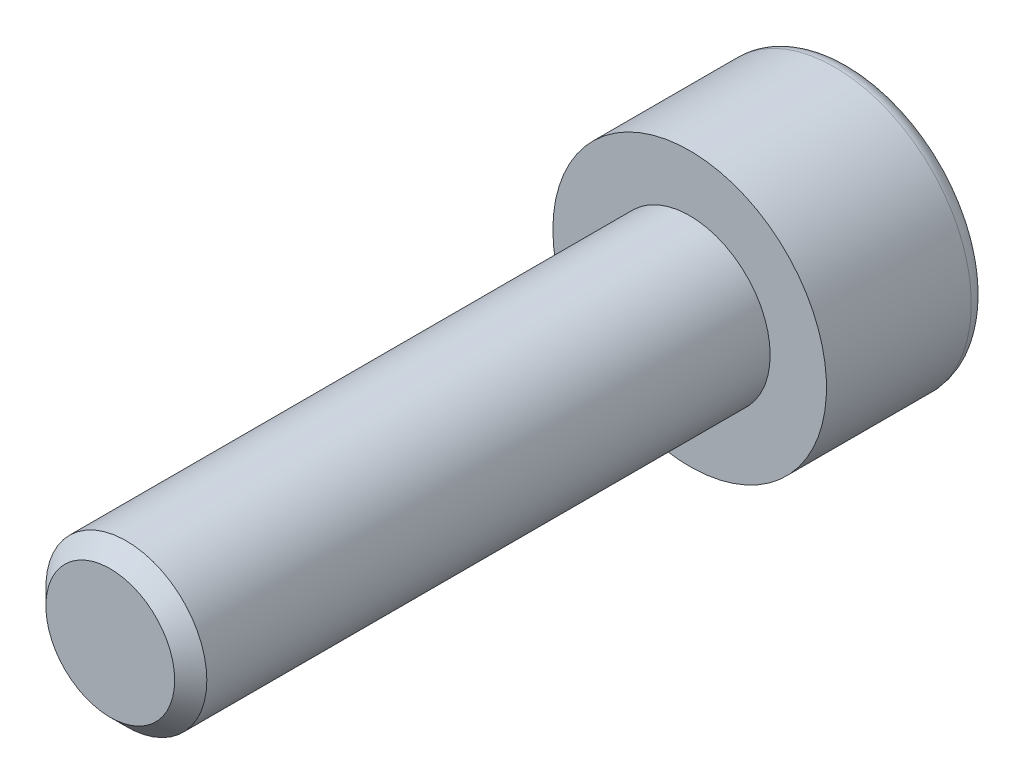
ISO-10303-21;
HEADER;
FILE_DESCRIPTION(('STEP AP214'),'2;1');
FILE_NAME('part.step','',(''),(''),'','','');
FILE_SCHEMA(('AUTOMOTIVE_DESIGN { 1 0 10303 214 1 1 1 1 }'));
ENDSEC;
DATA;
#1=APPLICATION_CONTEXT('core data for automotive mechanical design processes');
#2=APPLICATION_PROTOCOL_DEFINITION('international standard','automotive_design',2000,#1);
#3=PRODUCT_CONTEXT('',#1,'mechanical');
#4=PRODUCT('Part','Part','',(#3));
#5=PRODUCT_RELATED_PRODUCT_CATEGORY('part','',(#4));
#6=PRODUCT_DEFINITION_FORMATION('','',#4);
#7=PRODUCT_DEFINITION_CONTEXT('part definition',#1,'design');
#8=PRODUCT_DEFINITION('design','',#6,#7);
#9=PRODUCT_DEFINITION_SHAPE('','',#8);
#10=(LENGTH_UNIT() NAMED_UNIT(*) SI_UNIT(.MILLI.,.METRE.));
#11=(NAMED_UNIT(*) PLANE_ANGLE_UNIT() SI_UNIT($,.RADIAN.));
#12=(NAMED_UNIT(*) SI_UNIT($,.STERADIAN.) SOLID_ANGLE_UNIT());
#13=UNCERTAINTY_MEASURE_WITH_UNIT(LENGTH_MEASURE(1.E-05),#10,'distance_accuracy_value','');
#14=(GEOMETRIC_REPRESENTATION_CONTEXT(3) GLOBAL_UNCERTAINTY_ASSIGNED_CONTEXT((#13)) GLOBAL_UNIT_ASSIGNED_CONTEXT((#10,
#11,#12)) REPRESENTATION_CONTEXT('',''));
#15=CARTESIAN_POINT('',(0.,0.,0.));
#16=DIRECTION('',(0.,0.,1.));
#17=DIRECTION('',(1.,0.,0.));
#18=AXIS2_PLACEMENT_3D('',#15,#16,#17);
#19=CARTESIAN_POINT('',(0.,0.,-5.));
#20=DIRECTION('',(0.,0.,1.));
#21=DIRECTION('',(1.,0.,0.));
#22=AXIS2_PLACEMENT_3D('',#19,#20,#21);
#23=PLANE('',#22);
#24=CARTESIAN_POINT('',(0.,0.,-5.));
#25=DIRECTION('',(0.,0.,-1.));
#26=DIRECTION('',(-1.,0.,0.));
#27=AXIS2_PLACEMENT_3D('',#24,#25,#26);
#28=CIRCLE('',#27,3.75);
#29=CARTESIAN_POINT('',(-3.75,0.,-5.));
#30=VERTEX_POINT('',#29);
#31=EDGE_CURVE('E158',#30,#30,#28,.T.);
#32=ORIENTED_EDGE('',*,*,#31,.T.);
#33=EDGE_LOOP('',(#32));
#34=FACE_BOUND('',#33,.T.);
#35=DIRECTION('',(-0.86602540378444,0.499999999999997,0.));
#36=VECTOR('',#35,1.);
#37=CARTESIAN_POINT('',(0.,2.30940107675851,-5.));
#38=LINE('',#37,#36);
#39=CARTESIAN_POINT('',(2.,1.15470053837926,-5.));
#40=VERTEX_POINT('',#39);
#41=CARTESIAN_POINT('',(0.,2.30940107675851,-5.));
#42=VERTEX_POINT('',#41);
#43=EDGE_CURVE('E60',#40,#42,#38,.T.);
#44=ORIENTED_EDGE('',*,*,#43,.T.);
#45=DIRECTION('',(-0.866025403784438,-0.500000000000001,0.));
#46=VECTOR('',#45,1.);
#47=CARTESIAN_POINT('',(0.,2.30940107675851,-5.));
#48=LINE('',#47,#46);
#49=CARTESIAN_POINT('',(-2.,1.15470053837926,-5.));
#50=VERTEX_POINT('',#49);
#51=EDGE_CURVE('E131',#42,#50,#48,.T.);
#52=ORIENTED_EDGE('',*,*,#51,.T.);
#53=DIRECTION('',(0.,-1.,0.));
#54=VECTOR('',#53,1.);
#55=CARTESIAN_POINT('',(-2.,-1.15470053837926,-4.99999999999999));
#56=LINE('',#55,#54);
#57=CARTESIAN_POINT('',(-2.,-1.15470053837926,-4.99999999999999));
#58=VERTEX_POINT('',#57);
#59=EDGE_CURVE('E135',#50,#58,#56,.T.);
#60=ORIENTED_EDGE('',*,*,#59,.T.);
#61=DIRECTION('',(0.866025403784438,-0.500000000000001,0.));
#62=VECTOR('',#61,1.);
#63=CARTESIAN_POINT('',(0.,-2.3094010767585,-4.99999999999999));
#64=LINE('',#63,#62);
#65=CARTESIAN_POINT('',(0.,-2.3094010767585,-4.99999999999999));
#66=VERTEX_POINT('',#65);
#67=EDGE_CURVE('E138',#58,#66,#64,.T.);
#68=ORIENTED_EDGE('',*,*,#67,.T.);
#69=DIRECTION('',(0.86602540378444,0.499999999999998,0.));
#70=VECTOR('',#69,1.);
#71=CARTESIAN_POINT('',(0.,-2.3094010767585,-4.99999999999999));
#72=LINE('',#71,#70);
#73=CARTESIAN_POINT('',(2.,-1.15470053837925,-4.99999999999999));
#74=VERTEX_POINT('',#73);
#75=EDGE_CURVE('E121',#66,#74,#72,.T.);
#76=ORIENTED_EDGE('',*,*,#75,.T.);
#77=DIRECTION('',(0.,1.,0.));
#78=VECTOR('',#77,1.);
#79=CARTESIAN_POINT('',(2.,-1.15470053837925,-4.99999999999999));
#80=LINE('',#79,#78);
#81=EDGE_CURVE('E141',#74,#40,#80,.T.);
#82=ORIENTED_EDGE('',*,*,#81,.T.);
#83=EDGE_LOOP('',(#44,#52,#60,#68,#76,#82));
#84=FACE_BOUND('',#83,.T.);
#85=ADVANCED_FACE('F45',(#34,#84),#23,.F.);
#86=CARTESIAN_POINT('',(0.,0.,-4.5));
#87=DIRECTION('',(0.,0.,-1.));
#88=DIRECTION('',(-1.,0.,0.));
#89=AXIS2_PLACEMENT_3D('',#86,#87,#88);
#90=TOROIDAL_SURFACE('',#89,3.75,0.5);
#91=ORIENTED_EDGE('',*,*,#31,.F.);
#92=EDGE_LOOP('',(#91));
#93=FACE_BOUND('',#92,.T.);
#94=CARTESIAN_POINT('',(0.,0.,-4.5));
#95=DIRECTION('',(0.,0.,-1.));
#96=DIRECTION('',(-1.,0.,0.));
#97=AXIS2_PLACEMENT_3D('',#94,#95,#96);
#98=CIRCLE('',#97,4.25);
#99=CARTESIAN_POINT('',(-4.25,0.,-4.5));
#100=VERTEX_POINT('',#99);
#101=EDGE_CURVE('E155',#100,#100,#98,.T.);
#102=ORIENTED_EDGE('',*,*,#101,.T.);
#103=EDGE_LOOP('',(#102));
#104=FACE_BOUND('',#103,.T.);
#105=ADVANCED_FACE('F175',(#93,#104),#90,.T.);
#106=CARTESIAN_POINT('',(0.,0.,0.));
#107=DIRECTION('',(0.,0.,-1.));
#108=DIRECTION('',(-1.,0.,0.));
#109=AXIS2_PLACEMENT_3D('',#106,#107,#108);
#110=CYLINDRICAL_SURFACE('',#109,4.25);
#111=ORIENTED_EDGE('',*,*,#101,.F.);
#112=EDGE_LOOP('',(#111));
#113=FACE_BOUND('',#112,.T.);
#114=CARTESIAN_POINT('',(0.,0.,0.));
#115=DIRECTION('',(0.,0.,-1.));
#116=DIRECTION('',(-1.,0.,0.));
#117=AXIS2_PLACEMENT_3D('',#114,#115,#116);
#118=CIRCLE('',#117,4.25);
#119=CARTESIAN_POINT('',(-4.25,0.,0.));
#120=VERTEX_POINT('',#119);
#121=EDGE_CURVE('E152',#120,#120,#118,.T.);
#122=ORIENTED_EDGE('',*,*,#121,.T.);
#123=EDGE_LOOP('',(#122));
#124=FACE_BOUND('',#123,.T.);
#125=ADVANCED_FACE('F180',(#113,#124),#110,.T.);
#126=CARTESIAN_POINT('',(0.,0.,0.));
#127=DIRECTION('',(0.,0.,-1.));
#128=DIRECTION('',(-1.,0.,0.));
#129=AXIS2_PLACEMENT_3D('',#126,#127,#128);
#130=PLANE('',#129);
#131=CARTESIAN_POINT('',(0.,0.,0.));
#132=DIRECTION('',(0.,0.,1.));
#133=DIRECTION('',(1.,0.,0.));
#134=AXIS2_PLACEMENT_3D('',#131,#132,#133);
#135=CIRCLE('',#134,2.5);
#136=CARTESIAN_POINT('',(2.5,0.,0.));
#137=VERTEX_POINT('',#136);
#138=EDGE_CURVE('E132',#137,#137,#135,.T.);
#139=ORIENTED_EDGE('',*,*,#138,.F.);
#140=EDGE_LOOP('',(#139));
#141=FACE_BOUND('',#140,.T.);
#142=ORIENTED_EDGE('',*,*,#121,.F.);
#143=EDGE_LOOP('',(#142));
#144=FACE_BOUND('',#143,.T.);
#145=ADVANCED_FACE('F187',(#141,#144),#130,.F.);
#146=CARTESIAN_POINT('',(0.,2.30940107675851,-2.5));
#147=DIRECTION('',(-0.499999999999997,-0.86602540378444,0.));
#148=DIRECTION('',(0.86602540378444,-0.499999999999997,0.));
#149=AXIS2_PLACEMENT_3D('',#146,#147,#148);
#150=PLANE('',#149);
#151=ORIENTED_EDGE('',*,*,#43,.F.);
#152=DIRECTION('',(0.,0.,-1.));
#153=VECTOR('',#152,1.);
#154=CARTESIAN_POINT('',(2.,1.15470053837926,-2.5));
#155=LINE('',#154,#153);
#156=CARTESIAN_POINT('',(2.,1.15470053837926,-2.5));
#157=VERTEX_POINT('',#156);
#158=EDGE_CURVE('E126',#157,#40,#155,.T.);
#159=ORIENTED_EDGE('',*,*,#158,.F.);
#160=DIRECTION('',(-0.86602540378444,0.499999999999997,0.));
#161=VECTOR('',#160,1.);
#162=CARTESIAN_POINT('',(0.,2.30940107675851,-2.5));
#163=LINE('',#162,#161);
#164=CARTESIAN_POINT('',(0.,2.30940107675851,-2.5));
#165=VERTEX_POINT('',#164);
#166=EDGE_CURVE('E144',#157,#165,#163,.T.);
#167=ORIENTED_EDGE('',*,*,#166,.T.);
#168=DIRECTION('',(0.,0.,-1.));
#169=VECTOR('',#168,1.);
#170=CARTESIAN_POINT('',(0.,2.30940107675851,-2.5));
#171=LINE('',#170,#169);
#172=EDGE_CURVE('E150',#165,#42,#171,.T.);
#173=ORIENTED_EDGE('',*,*,#172,.T.);
#174=EDGE_LOOP('',(#151,#159,#167,#173));
#175=FACE_BOUND('',#174,.T.);
#176=ADVANCED_FACE('F191',(#175),#150,.T.);
#177=CARTESIAN_POINT('',(0.,2.30940107675851,-2.5));
#178=DIRECTION('',(0.500000000000001,-0.866025403784438,0.));
#179=DIRECTION('',(0.866025403784438,0.500000000000001,0.));
#180=AXIS2_PLACEMENT_3D('',#177,#178,#179);
#181=PLANE('',#180);
#182=ORIENTED_EDGE('',*,*,#51,.F.);
#183=ORIENTED_EDGE('',*,*,#172,.F.);
#184=DIRECTION('',(-0.866025403784438,-0.500000000000001,0.));
#185=VECTOR('',#184,1.);
#186=CARTESIAN_POINT('',(0.,2.30940107675851,-2.5));
#187=LINE('',#186,#185);
#188=CARTESIAN_POINT('',(-2.,1.15470053837926,-2.5));
#189=VERTEX_POINT('',#188);
#190=EDGE_CURVE('E99',#165,#189,#187,.T.);
#191=ORIENTED_EDGE('',*,*,#190,.T.);
#192=DIRECTION('',(0.,0.,-1.));
#193=VECTOR('',#192,1.);
#194=CARTESIAN_POINT('',(-2.,1.15470053837926,-2.5));
#195=LINE('',#194,#193);
#196=EDGE_CURVE('E148',#189,#50,#195,.T.);
#197=ORIENTED_EDGE('',*,*,#196,.T.);
#198=EDGE_LOOP('',(#182,#183,#191,#197));
#199=FACE_BOUND('',#198,.T.);
#200=ADVANCED_FACE('F195',(#199),#181,.T.);
#201=CARTESIAN_POINT('',(-2.,-1.15470053837926,-2.5));
#202=DIRECTION('',(1.,0.,0.));
#203=DIRECTION('',(0.,0.,-1.));
#204=AXIS2_PLACEMENT_3D('',#201,#202,#203);
#205=PLANE('',#204);
#206=ORIENTED_EDGE('',*,*,#59,.F.);
#207=ORIENTED_EDGE('',*,*,#196,.F.);
#208=DIRECTION('',(0.,-1.,0.));
#209=VECTOR('',#208,1.);
#210=CARTESIAN_POINT('',(-2.,-1.15470053837926,-2.5));
#211=LINE('',#210,#209);
#212=CARTESIAN_POINT('',(-2.,-1.15470053837926,-2.5));
#213=VERTEX_POINT('',#212);
#214=EDGE_CURVE('E117',#189,#213,#211,.T.);
#215=ORIENTED_EDGE('',*,*,#214,.T.);
#216=DIRECTION('',(0.,0.,-1.));
#217=VECTOR('',#216,1.);
#218=CARTESIAN_POINT('',(-2.,-1.15470053837926,-2.5));
#219=LINE('',#218,#217);
#220=EDGE_CURVE('E114',#213,#58,#219,.T.);
#221=ORIENTED_EDGE('',*,*,#220,.T.);
#222=EDGE_LOOP('',(#206,#207,#215,#221));
#223=FACE_BOUND('',#222,.T.);
#224=ADVANCED_FACE('F198',(#223),#205,.T.);
#225=CARTESIAN_POINT('',(0.,-2.3094010767585,-2.49999999999999));
#226=DIRECTION('',(0.500000000000001,0.866025403784438,0.));
#227=DIRECTION('',(-0.866025403784438,0.500000000000001,0.));
#228=AXIS2_PLACEMENT_3D('',#225,#226,#227);
#229=PLANE('',#228);
#230=ORIENTED_EDGE('',*,*,#67,.F.);
#231=ORIENTED_EDGE('',*,*,#220,.F.);
#232=DIRECTION('',(0.866025403784438,-0.500000000000001,0.));
#233=VECTOR('',#232,1.);
#234=CARTESIAN_POINT('',(0.,-2.3094010767585,-2.49999999999999));
#235=LINE('',#234,#233);
#236=CARTESIAN_POINT('',(0.,-2.3094010767585,-2.49999999999999));
#237=VERTEX_POINT('',#236);
#238=EDGE_CURVE('E109',#213,#237,#235,.T.);
#239=ORIENTED_EDGE('',*,*,#238,.T.);
#240=DIRECTION('',(0.,0.,-1.));
#241=VECTOR('',#240,1.);
#242=CARTESIAN_POINT('',(0.,-2.3094010767585,-2.49999999999999));
#243=LINE('',#242,#241);
#244=EDGE_CURVE('E113',#237,#66,#243,.T.);
#245=ORIENTED_EDGE('',*,*,#244,.T.);
#246=EDGE_LOOP('',(#230,#231,#239,#245));
#247=FACE_BOUND('',#246,.T.);
#248=ADVANCED_FACE('F112',(#247),#229,.T.);
#249=CARTESIAN_POINT('',(0.,-2.3094010767585,-2.49999999999999));
#250=DIRECTION('',(-0.499999999999998,0.86602540378444,0.));
#251=DIRECTION('',(-0.86602540378444,-0.499999999999998,0.));
#252=AXIS2_PLACEMENT_3D('',#249,#250,#251);
#253=PLANE('',#252);
#254=ORIENTED_EDGE('',*,*,#75,.F.);
#255=ORIENTED_EDGE('',*,*,#244,.F.);
#256=DIRECTION('',(0.86602540378444,0.499999999999998,0.));
#257=VECTOR('',#256,1.);
#258=CARTESIAN_POINT('',(0.,-2.3094010767585,-2.49999999999999));
#259=LINE('',#258,#257);
#260=CARTESIAN_POINT('',(2.,-1.15470053837925,-2.5));
#261=VERTEX_POINT('',#260);
#262=EDGE_CURVE('E116',#237,#261,#259,.T.);
#263=ORIENTED_EDGE('',*,*,#262,.T.);
#264=DIRECTION('',(0.,0.,-1.));
#265=VECTOR('',#264,1.);
#266=CARTESIAN_POINT('',(2.,-1.15470053837925,-2.5));
#267=LINE('',#266,#265);
#268=EDGE_CURVE('E90',#261,#74,#267,.T.);
#269=ORIENTED_EDGE('',*,*,#268,.T.);
#270=EDGE_LOOP('',(#254,#255,#263,#269));
#271=FACE_BOUND('',#270,.T.);
#272=ADVANCED_FACE('F119',(#271),#253,.T.);
#273=CARTESIAN_POINT('',(2.,-1.15470053837925,-2.5));
#274=DIRECTION('',(-1.,0.,0.));
#275=DIRECTION('',(0.,0.,1.));
#276=AXIS2_PLACEMENT_3D('',#273,#274,#275);
#277=PLANE('',#276);
#278=ORIENTED_EDGE('',*,*,#81,.F.);
#279=ORIENTED_EDGE('',*,*,#268,.F.);
#280=DIRECTION('',(0.,1.,0.));
#281=VECTOR('',#280,1.);
#282=CARTESIAN_POINT('',(2.,-1.15470053837925,-2.5));
#283=LINE('',#282,#281);
#284=EDGE_CURVE('E68',#261,#157,#283,.T.);
#285=ORIENTED_EDGE('',*,*,#284,.T.);
#286=ORIENTED_EDGE('',*,*,#158,.T.);
#287=EDGE_LOOP('',(#278,#279,#285,#286));
#288=FACE_BOUND('',#287,.T.);
#289=ADVANCED_FACE('F207',(#288),#277,.T.);
#290=CARTESIAN_POINT('',(2.,1.15470053837926,-2.5));
#291=DIRECTION('',(0.,0.,1.));
#292=DIRECTION('',(1.,0.,0.));
#293=AXIS2_PLACEMENT_3D('',#290,#291,#292);
#294=PLANE('',#293);
#295=ORIENTED_EDGE('',*,*,#166,.F.);
#296=ORIENTED_EDGE('',*,*,#284,.F.);
#297=ORIENTED_EDGE('',*,*,#262,.F.);
#298=ORIENTED_EDGE('',*,*,#238,.F.);
#299=ORIENTED_EDGE('',*,*,#214,.F.);
#300=ORIENTED_EDGE('',*,*,#190,.F.);
#301=EDGE_LOOP('',(#295,#296,#297,#298,#299,#300));
#302=FACE_BOUND('',#301,.T.);
#303=ADVANCED_FACE('F124',(#302),#294,.F.);
#304=CARTESIAN_POINT('',(0.,0.,18.));
#305=DIRECTION('',(0.,0.,1.));
#306=DIRECTION('',(1.,0.,0.));
#307=AXIS2_PLACEMENT_3D('',#304,#305,#306);
#308=PLANE('',#307);
#309=CARTESIAN_POINT('',(0.,0.,18.));
#310=DIRECTION('',(0.,0.,1.));
#311=DIRECTION('',(1.,0.,0.));
#312=AXIS2_PLACEMENT_3D('',#309,#310,#311);
#313=CIRCLE('',#312,2.);
#314=CARTESIAN_POINT('',(2.,0.,18.));
#315=VERTEX_POINT('',#314);
#316=EDGE_CURVE('E53',#315,#315,#313,.T.);
#317=ORIENTED_EDGE('',*,*,#316,.T.);
#318=EDGE_LOOP('',(#317));
#319=FACE_BOUND('',#318,.T.);
#320=ADVANCED_FACE('F163',(#319),#308,.T.);
#321=CARTESIAN_POINT('',(0.,0.,0.));
#322=DIRECTION('',(0.,0.,1.));
#323=DIRECTION('',(1.,0.,0.));
#324=AXIS2_PLACEMENT_3D('',#321,#322,#323);
#325=CYLINDRICAL_SURFACE('',#324,2.5);
#326=CARTESIAN_POINT('',(0.,0.,17.5));
#327=DIRECTION('',(0.,0.,1.));
#328=DIRECTION('',(1.,0.,0.));
#329=AXIS2_PLACEMENT_3D('',#326,#327,#328);
#330=CIRCLE('',#329,2.5);
#331=CARTESIAN_POINT('',(2.5,0.,17.5));
#332=VERTEX_POINT('',#331);
#333=EDGE_CURVE('E13',#332,#332,#330,.F.);
#334=ORIENTED_EDGE('',*,*,#333,.T.);
#335=EDGE_LOOP('',(#334));
#336=FACE_BOUND('',#335,.T.);
#337=ORIENTED_EDGE('',*,*,#138,.T.);
#338=EDGE_LOOP('',(#337));
#339=FACE_BOUND('',#338,.T.);
#340=ADVANCED_FACE('F166',(#336,#339),#325,.T.);
#341=CARTESIAN_POINT('',(0.,0.,18.));
#342=DIRECTION('',(0.,0.,-1.));
#343=DIRECTION('',(-1.,0.,0.));
#344=AXIS2_PLACEMENT_3D('',#341,#342,#343);
#345=CONICAL_SURFACE('',#344,2.,0.785398163397448);
#346=ORIENTED_EDGE('',*,*,#333,.F.);
#347=EDGE_LOOP('',(#346));
#348=FACE_BOUND('',#347,.T.);
#349=ORIENTED_EDGE('',*,*,#316,.F.);
#350=EDGE_LOOP('',(#349));
#351=FACE_BOUND('',#350,.T.);
#352=ADVANCED_FACE('F47',(#348,#351),#345,.T.);
#353=CLOSED_SHELL('',(#85,#105,#125,#145,#176,#200,#224,#248,#272,#289,#303,#320,#340,#352));
#354=MANIFOLD_SOLID_BREP('B2',#353);
#355=ADVANCED_BREP_SHAPE_REPRESENTATION('',(#18,#354),#14);
#356=SHAPE_DEFINITION_REPRESENTATION(#9,#355);
ENDSEC;
END-ISO-10303-21;
